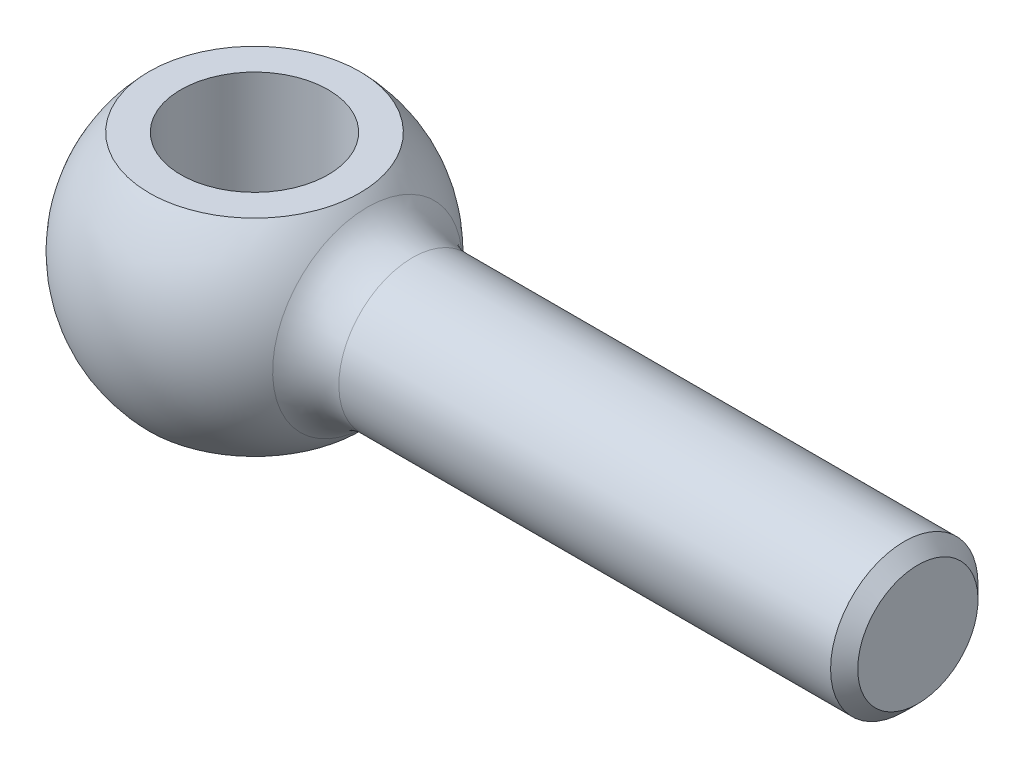
ISO-10303-21;
HEADER;
FILE_DESCRIPTION(('STEP AP214'),'2;1');
FILE_NAME('part.step','',(''),(''),'','','');
FILE_SCHEMA(('AUTOMOTIVE_DESIGN { 1 0 10303 214 1 1 1 1 }'));
ENDSEC;
DATA;
#1=APPLICATION_CONTEXT('core data for automotive mechanical design processes');
#2=APPLICATION_PROTOCOL_DEFINITION('international standard','automotive_design',2000,#1);
#3=PRODUCT_CONTEXT('',#1,'mechanical');
#4=PRODUCT('Part','Part','',(#3));
#5=PRODUCT_RELATED_PRODUCT_CATEGORY('part','',(#4));
#6=PRODUCT_DEFINITION_FORMATION('','',#4);
#7=PRODUCT_DEFINITION_CONTEXT('part definition',#1,'design');
#8=PRODUCT_DEFINITION('design','',#6,#7);
#9=PRODUCT_DEFINITION_SHAPE('','',#8);
#10=(LENGTH_UNIT() NAMED_UNIT(*) SI_UNIT(.MILLI.,.METRE.));
#11=(NAMED_UNIT(*) PLANE_ANGLE_UNIT() SI_UNIT($,.RADIAN.));
#12=(NAMED_UNIT(*) SI_UNIT($,.STERADIAN.) SOLID_ANGLE_UNIT());
#13=UNCERTAINTY_MEASURE_WITH_UNIT(LENGTH_MEASURE(1.E-05),#10,'distance_accuracy_value','');
#14=(GEOMETRIC_REPRESENTATION_CONTEXT(3) GLOBAL_UNCERTAINTY_ASSIGNED_CONTEXT((#13)) GLOBAL_UNIT_ASSIGNED_CONTEXT((#10,
#11,#12)) REPRESENTATION_CONTEXT('',''));
#15=CARTESIAN_POINT('',(0.,0.,0.));
#16=DIRECTION('',(0.,0.,1.));
#17=DIRECTION('',(1.,0.,0.));
#18=AXIS2_PLACEMENT_3D('',#15,#16,#17);
#19=CARTESIAN_POINT('',(-19.921175,53.1747455333215,0.));
#20=DIRECTION('',(0.,-1.,0.));
#21=DIRECTION('',(0.,0.,-1.));
#22=AXIS2_PLACEMENT_3D('',#19,#20,#21);
#23=CYLINDRICAL_SURFACE('',#22,5.);
#24=CARTESIAN_POINT('',(-19.921175,-7.,0.));
#25=DIRECTION('',(0.,-1.,0.));
#26=DIRECTION('',(0.,0.,-1.));
#27=AXIS2_PLACEMENT_3D('',#24,#25,#26);
#28=CIRCLE('',#27,5.);
#29=CARTESIAN_POINT('',(-19.921175,-7.,-5.));
#30=VERTEX_POINT('',#29);
#31=EDGE_CURVE('E19',#30,#30,#28,.T.);
#32=ORIENTED_EDGE('',*,*,#31,.T.);
#33=EDGE_LOOP('',(#32));
#34=FACE_BOUND('',#33,.T.);
#35=CARTESIAN_POINT('',(-19.921175,7.,0.));
#36=DIRECTION('',(0.,-1.,0.));
#37=DIRECTION('',(0.,0.,-1.));
#38=AXIS2_PLACEMENT_3D('',#35,#36,#37);
#39=CIRCLE('',#38,5.);
#40=CARTESIAN_POINT('',(-19.921175,7.,-5.));
#41=VERTEX_POINT('',#40);
#42=EDGE_CURVE('E45',#41,#41,#39,.F.);
#43=ORIENTED_EDGE('',*,*,#42,.T.);
#44=EDGE_LOOP('',(#43));
#45=FACE_BOUND('',#44,.T.);
#46=ADVANCED_FACE('F16',(#34,#45),#23,.F.);
#47=CARTESIAN_POINT('',(-9.921175,-7.,-7.14142842854285));
#48=DIRECTION('',(0.,1.,0.));
#49=DIRECTION('',(0.,0.,1.));
#50=AXIS2_PLACEMENT_3D('',#47,#48,#49);
#51=PLANE('',#50);
#52=ORIENTED_EDGE('',*,*,#31,.F.);
#53=EDGE_LOOP('',(#52));
#54=FACE_BOUND('',#53,.T.);
#55=CARTESIAN_POINT('',(-19.921175,-7.,-7.14142842854285));
#56=CARTESIAN_POINT('',(-20.121815802126,-7.,-7.14142986859224));
#57=CARTESIAN_POINT('',(-20.3224329771535,-7.,-7.13296934888317));
#58=CARTESIAN_POINT('',(-20.7223083544296,-7.,-7.09918632357595));
#59=CARTESIAN_POINT('',(-20.9215661852289,-6.99999999999999,-7.07385938198513));
#60=CARTESIAN_POINT('',(-21.3174147546647,-7.00000000000001,-7.00648721093299));
#61=CARTESIAN_POINT('',(-21.5140029565603,-7.00000000000002,-6.96442709358572));
#62=CARTESIAN_POINT('',(-21.9030073479158,-6.99999999999998,-6.8638701159207));
#63=CARTESIAN_POINT('',(-22.0954219852172,-6.99999999999993,-6.80536724969287));
#64=CARTESIAN_POINT('',(-22.4744732752498,-6.99999999999993,-6.67240392502897));
#65=CARTESIAN_POINT('',(-22.6611146729108,-6.99999999999998,-6.59795699230074));
#66=CARTESIAN_POINT('',(-23.0275306318683,-7.00000000000002,-6.43357519762648));
#67=CARTESIAN_POINT('',(-23.2073026360902,-7.,-6.34363463562185));
#68=CARTESIAN_POINT('',(-23.5585194217161,-7.,-6.14898457253382));
#69=CARTESIAN_POINT('',(-23.7299692772299,-7.,-6.04428422666276));
#70=CARTESIAN_POINT('',(-24.0635040866723,-7.,-5.82077528687992));
#71=CARTESIAN_POINT('',(-24.2255855610231,-7.,-5.70196150041679));
#72=CARTESIAN_POINT('',(-24.5391210307749,-7.,-5.45113461015148));
#73=CARTESIAN_POINT('',(-24.690577822971,-7.,-5.31912500231585));
#74=CARTESIAN_POINT('',(-24.981888574393,-7.,-5.04276727767858));
#75=CARTESIAN_POINT('',(-25.1217382286144,-7.,-4.89841462287307));
#76=CARTESIAN_POINT('',(-25.3887335416484,-7.,-4.5984889724675));
#77=CARTESIAN_POINT('',(-25.5158833747975,-7.,-4.44291969283042));
#78=CARTESIAN_POINT('',(-25.7566723691874,-7.,-4.12156491852506));
#79=CARTESIAN_POINT('',(-25.8703065247082,-7.,-3.95577567305133));
#80=CARTESIAN_POINT('',(-26.0831600756499,-7.,-3.61527806461891));
#81=CARTESIAN_POINT('',(-26.1823850428817,-7.,-3.44057318470467));
#82=CARTESIAN_POINT('',(-26.3658014953218,-7.,-3.08336104801744));
#83=CARTESIAN_POINT('',(-26.449987416743,-7.,-2.90085093447142));
#84=CARTESIAN_POINT('',(-26.6026534327003,-7.,-2.52945436820556));
#85=CARTESIAN_POINT('',(-26.6711393436741,-7.,-2.34057030671274));
#86=CARTESIAN_POINT('',(-26.7919816966742,-7.,-1.95763818981546));
#87=CARTESIAN_POINT('',(-26.8443321743561,-7.,-1.76358825360813));
#88=CARTESIAN_POINT('',(-26.9324781874185,-7.,-1.37182470924655));
#89=CARTESIAN_POINT('',(-26.968279793977,-7.,-1.17411247238744));
#90=CARTESIAN_POINT('',(-27.0231220903994,-7.,-0.776356914190344));
#91=CARTESIAN_POINT('',(-27.0421565872414,-7.,-0.576312759164369));
#92=CARTESIAN_POINT('',(-27.0738033201154,-7.,0.0250369248536359));
#93=CARTESIAN_POINT('',(-27.0610543880239,-7.,0.427986321027078));
#94=CARTESIAN_POINT('',(-26.9680842882136,-7.,1.22580539982465));
#95=CARTESIAN_POINT('',(-26.8878630953176,-7.,1.6206750794338));
#96=CARTESIAN_POINT('',(-26.6622672948254,-7.,2.39140128766026));
#97=CARTESIAN_POINT('',(-26.5168926184526,-7.,2.76725779620665));
#98=CARTESIAN_POINT('',(-26.1651054719343,-7.,3.48921380646209));
#99=CARTESIAN_POINT('',(-25.9586930216517,-7.,3.83531331785465));
#100=CARTESIAN_POINT('',(-25.4906928461824,-7.00000000000001,4.48795036671183));
#101=CARTESIAN_POINT('',(-25.2291051433289,-7.,4.79448792018974));
#102=CARTESIAN_POINT('',(-24.6581792730066,-7.,5.35929426043238));
#103=CARTESIAN_POINT('',(-24.3488410989941,-7.,5.61756304058228));
#104=CARTESIAN_POINT('',(-23.6911956846309,-7.00000000000001,6.07850174196653));
#105=CARTESIAN_POINT('',(-23.3428884391877,-7.00000000000001,6.28117165593503));
#106=CARTESIAN_POINT('',(-22.6171922927163,-7.00000000000001,6.62515898805196));
#107=CARTESIAN_POINT('',(-22.2398033929334,-7.00000000000001,6.76647640882725));
#108=CARTESIAN_POINT('',(-21.4666569194695,-7.,6.98374728002891));
#109=CARTESIAN_POINT('',(-21.0708993466161,-6.99999999999999,7.05970073339998));
#110=CARTESIAN_POINT('',(-20.2722499000277,-7.00000000000001,7.14408755076116));
#111=CARTESIAN_POINT('',(-19.8693580262928,-7.00000000000002,7.15252091475126));
#112=CARTESIAN_POINT('',(-19.0678768778328,-6.99999999999999,7.10162818869298));
#113=CARTESIAN_POINT('',(-18.6692876033016,-6.99999999999993,7.04230209559198));
#114=CARTESIAN_POINT('',(-17.8877264265291,-6.99999999999993,6.85757443490689));
#115=CARTESIAN_POINT('',(-17.5047545249564,-6.99999999999999,6.73217286449371));
#116=CARTESIAN_POINT('',(-16.7652996316435,-7.00000000000002,6.41885443506071));
#117=CARTESIAN_POINT('',(-16.4088166364416,-7.00000000000001,6.2309375842106));
#118=CARTESIAN_POINT('',(-15.7324589633657,-7.,5.79792159206619));
#119=CARTESIAN_POINT('',(-15.4125842804748,-7.,5.55282245860825));
#120=CARTESIAN_POINT('',(-14.8185236754241,-7.00000000000001,5.01240476893933));
#121=CARTESIAN_POINT('',(-14.5443377717577,-7.,4.71708619240125));
#122=CARTESIAN_POINT('',(-14.0494369334286,-7.,4.08459284269662));
#123=CARTESIAN_POINT('',(-13.8287220161664,-7.,3.74741805590921));
#124=CARTESIAN_POINT('',(-13.447033414173,-7.00000000000001,3.04085867103406));
#125=CARTESIAN_POINT('',(-13.2860596663786,-7.,2.67147410694765));
#126=CARTESIAN_POINT('',(-13.0284059260787,-7.,1.91070260901831));
#127=CARTESIAN_POINT('',(-12.9317259095823,-7.,1.51931568338555));
#128=CARTESIAN_POINT('',(-12.8369974153508,-7.,0.924631338080583));
#129=CARTESIAN_POINT('',(-12.8138042506701,-7.,0.725026595796795));
#130=CARTESIAN_POINT('',(-12.7843083533849,-7.,0.324592888927716));
#131=CARTESIAN_POINT('',(-12.7779993902821,-7.,0.123764403347191));
#132=CARTESIAN_POINT('',(-12.7823240599294,-7.,-0.277769768974396));
#133=CARTESIAN_POINT('',(-12.7929639163794,-7.,-0.478475383520475));
#134=CARTESIAN_POINT('',(-12.8311085991324,-7.,-0.878206372571495));
#135=CARTESIAN_POINT('',(-12.8586071997277,-7.,-1.07723233985526));
#136=CARTESIAN_POINT('',(-12.9302836255055,-7.,-1.47233335459713));
#137=CARTESIAN_POINT('',(-12.9744676384289,-7.,-1.66840727921256));
#138=CARTESIAN_POINT('',(-13.079179870739,-7.,-2.05606363995877));
#139=CARTESIAN_POINT('',(-13.1397020521615,-7.,-2.24764770699955));
#140=CARTESIAN_POINT('',(-13.2766945212751,-7.,-2.62511071035591));
#141=CARTESIAN_POINT('',(-13.353170985662,-7.,-2.81098740499663));
#142=CARTESIAN_POINT('',(-13.5214826895267,-7.,-3.1755685360639));
#143=CARTESIAN_POINT('',(-13.6133122499397,-7.,-3.35427559432129));
#144=CARTESIAN_POINT('',(-13.8117300597951,-7.,-3.70337767922704));
#145=CARTESIAN_POINT('',(-13.9183231679959,-7.,-3.87376994436641));
#146=CARTESIAN_POINT('',(-14.1454449479916,-7.,-4.20490623490604));
#147=CARTESIAN_POINT('',(-14.2659684614465,-7.,-4.36565379839525));
#148=CARTESIAN_POINT('',(-14.5201598888321,-7.,-4.67646779086718));
#149=CARTESIAN_POINT('',(-14.6538312684219,-7.,-4.82653138558618));
#150=CARTESIAN_POINT('',(-14.9332895964747,-7.,-5.11481034450373));
#151=CARTESIAN_POINT('',(-15.0790720570029,-7.,-5.25303005939112));
#152=CARTESIAN_POINT('',(-15.3818531340141,-7.,-5.51678277875058));
#153=CARTESIAN_POINT('',(-15.5388586259114,-7.,-5.64230789061971));
#154=CARTESIAN_POINT('',(-15.8628290246504,-7.,-5.87963721906419));
#155=CARTESIAN_POINT('',(-16.0297902396256,-7.,-5.99144647542316));
#156=CARTESIAN_POINT('',(-16.3726831147139,-7.,-6.2006917917259));
#157=CARTESIAN_POINT('',(-16.5486222417229,-7.,-6.29811561628654));
#158=CARTESIAN_POINT('',(-16.9080210502521,-7.,-6.47775029745588));
#159=CARTESIAN_POINT('',(-17.0914779587107,-7.,-6.55996670296368));
#160=CARTESIAN_POINT('',(-17.4645051204215,-7.,-6.70857974405571));
#161=CARTESIAN_POINT('',(-17.6540697815227,-7.,-6.7749904086117));
#162=CARTESIAN_POINT('',(-18.0380546433467,-7.,-6.89159759552849));
#163=CARTESIAN_POINT('',(-18.2324735537421,-6.99999999999999,-6.94179837829547));
#164=CARTESIAN_POINT('',(-18.6737224352808,-6.99999999999999,-7.03609425376486));
#165=CARTESIAN_POINT('',(-18.9215550401293,-7.,-7.0755610479892));
#166=CARTESIAN_POINT('',(-19.4199957132269,-7.,-7.12822723617195));
#167=CARTESIAN_POINT('',(-19.6706037814759,-7.,-7.14142663013034));
#168=CARTESIAN_POINT('',(-19.921175,-7.,-7.14142842854285));
#169=B_SPLINE_CURVE_WITH_KNOTS('',3,(#55,#56,#57,#58,#59,#60,#61,#62,#63,#64,#65,#66,#67,#68,
#69,#70,#71,#72,#73,#74,#75,#76,#77,#78,#79,#80,#81,#82,#83,#84,#85,#86,#87,#88,#89,#90,#91,#92,
#93,#94,#95,#96,#97,#98,#99,#100,#101,#102,#103,#104,#105,#106,#107,#108,#109,#110,#111,#112,
#113,#114,#115,#116,#117,#118,#119,#120,#121,#122,#123,#124,#125,#126,#127,#128,#129,#130,#131,
#132,#133,#134,#135,#136,#137,#138,#139,#140,#141,#142,#143,#144,#145,#146,#147,#148,#149,#150,
#151,#152,#153,#154,#155,#156,#157,#158,#159,#160,#161,#162,#163,#164,#165,#166,#167,#168),
.UNSPECIFIED.,.T.,.F.,(4,2,2,2,2,2,2,2,2,2,2,2,2,2,2,2,2,2,2,2,2,2,2,2,2,2,2,2,2,2,2,2,2,2,2,2,
2,2,2,2,2,2,2,2,2,2,2,2,2,2,2,2,2,2,2,2,4),(0.,0.601703537374053,1.20356538972438,
1.80596393408615,2.4085827982933,3.01069245819608,3.61302410732358,4.21498377222909,
4.81716559731527,5.4191883071872,6.0214333143561,6.62347971210541,7.22574839636951,
7.82778356890978,8.43004100885713,9.03207496650202,9.63433119542459,10.236366302774,
10.8386236818946,12.0418432976601,13.245063362403,14.4482846972761,15.6515056405957,
16.8547260968921,18.0579467180798,19.2611674965082,20.4643882234193,21.6676088961242,
22.8708295688291,24.0740502957402,25.2772710741686,26.4804916953562,27.6837121516527,
28.8869330949723,30.0901544298454,31.2933744945883,32.4965941103538,33.0988514894744,
33.7008865968238,34.3031428257464,34.9051767833913,35.5074342233386,36.1094693958789,
36.711738080143,37.3137844778923,37.9160294850612,38.5180521949331,39.1202340200193,
39.7221936849248,40.3245253340523,40.9266349939551,41.5292538581623,42.131652402524,
42.7335142548744,43.3352177922484,44.0866581122258,44.8380984322032),.UNSPECIFIED.);
#170=CARTESIAN_POINT('',(-19.921175,-7.,-7.14142842854285));
#171=VERTEX_POINT('',#170);
#172=EDGE_CURVE('E43',#171,#171,#169,.T.);
#173=ORIENTED_EDGE('',*,*,#172,.F.);
#174=EDGE_LOOP('',(#173));
#175=FACE_BOUND('',#174,.T.);
#176=ADVANCED_FACE('F55',(#54,#175),#51,.F.);
#177=CARTESIAN_POINT('',(-9.921175,7.,7.14142842854285));
#178=DIRECTION('',(0.,-1.,0.));
#179=DIRECTION('',(0.,0.,-1.));
#180=AXIS2_PLACEMENT_3D('',#177,#178,#179);
#181=PLANE('',#180);
#182=ORIENTED_EDGE('',*,*,#42,.F.);
#183=EDGE_LOOP('',(#182));
#184=FACE_BOUND('',#183,.T.);
#185=CARTESIAN_POINT('',(-19.921175,7.,7.14142842854285));
#186=CARTESIAN_POINT('',(-20.121815802126,7.,7.14142986859223));
#187=CARTESIAN_POINT('',(-20.3224329771535,7.,7.13296934888316));
#188=CARTESIAN_POINT('',(-20.7223083544296,7.,7.09918632357594));
#189=CARTESIAN_POINT('',(-20.9215661852289,7.,7.07385938198513));
#190=CARTESIAN_POINT('',(-21.3174147546647,7.,7.00648721093298));
#191=CARTESIAN_POINT('',(-21.5140029565603,7.00000000000002,6.96442709358571));
#192=CARTESIAN_POINT('',(-21.9030073479158,6.99999999999998,6.8638701159207));
#193=CARTESIAN_POINT('',(-22.0954219852172,6.99999999999994,6.80536724969286));
#194=CARTESIAN_POINT('',(-22.4744732752498,6.99999999999994,6.67240392502897));
#195=CARTESIAN_POINT('',(-22.6611146729108,6.99999999999998,6.59795699230074));
#196=CARTESIAN_POINT('',(-23.0275306318683,7.00000000000002,6.43357519762648));
#197=CARTESIAN_POINT('',(-23.2073026360902,7.,6.34363463562185));
#198=CARTESIAN_POINT('',(-23.5585194217161,7.,6.14898457253381));
#199=CARTESIAN_POINT('',(-23.7299692772298,7.,6.04428422666276));
#200=CARTESIAN_POINT('',(-24.0635040866723,7.,5.82077528687992));
#201=CARTESIAN_POINT('',(-24.2255855610231,7.,5.70196150041679));
#202=CARTESIAN_POINT('',(-24.5391210307749,7.,5.45113461015148));
#203=CARTESIAN_POINT('',(-24.6905778229709,7.,5.31912500231584));
#204=CARTESIAN_POINT('',(-24.981888574393,7.,5.04276727767858));
#205=CARTESIAN_POINT('',(-25.1217382286144,7.,4.89841462287307));
#206=CARTESIAN_POINT('',(-25.3887335416484,7.,4.5984889724675));
#207=CARTESIAN_POINT('',(-25.5158833747975,7.,4.44291969283042));
#208=CARTESIAN_POINT('',(-25.7566723691874,7.,4.12156491852506));
#209=CARTESIAN_POINT('',(-25.8703065247082,7.,3.95577567305132));
#210=CARTESIAN_POINT('',(-26.0831600756499,7.,3.61527806461891));
#211=CARTESIAN_POINT('',(-26.1823850428817,7.,3.44057318470466));
#212=CARTESIAN_POINT('',(-26.3658014953218,7.,3.08336104801744));
#213=CARTESIAN_POINT('',(-26.449987416743,7.,2.90085093447142));
#214=CARTESIAN_POINT('',(-26.6026534327003,7.,2.52945436820556));
#215=CARTESIAN_POINT('',(-26.6711393436741,7.,2.34057030671274));
#216=CARTESIAN_POINT('',(-26.7919816966742,7.,1.95763818981546));
#217=CARTESIAN_POINT('',(-26.8443321743561,7.,1.76358825360813));
#218=CARTESIAN_POINT('',(-26.9324781874185,7.,1.37182470924656));
#219=CARTESIAN_POINT('',(-26.968279793977,7.,1.17411247238744));
#220=CARTESIAN_POINT('',(-27.0231220903994,7.,0.776356914190345));
#221=CARTESIAN_POINT('',(-27.0421565872414,7.,0.57631275916437));
#222=CARTESIAN_POINT('',(-27.0738033201154,7.,-0.0250369248536355));
#223=CARTESIAN_POINT('',(-27.0610543880239,7.,-0.427986321027079));
#224=CARTESIAN_POINT('',(-26.9680842882136,7.,-1.22580539982465));
#225=CARTESIAN_POINT('',(-26.8878630953176,7.,-1.62067507943381));
#226=CARTESIAN_POINT('',(-26.6622672948254,7.,-2.39140128766026));
#227=CARTESIAN_POINT('',(-26.5168926184526,7.,-2.76725779620665));
#228=CARTESIAN_POINT('',(-26.1651054719343,7.,-3.48921380646209));
#229=CARTESIAN_POINT('',(-25.9586930216517,7.,-3.83531331785465));
#230=CARTESIAN_POINT('',(-25.4906928461824,7.,-4.48795036671183));
#231=CARTESIAN_POINT('',(-25.2291051433289,7.,-4.79448792018973));
#232=CARTESIAN_POINT('',(-24.6581792730066,7.,-5.35929426043238));
#233=CARTESIAN_POINT('',(-24.3488410989941,7.,-5.61756304058228));
#234=CARTESIAN_POINT('',(-23.6911956846309,7.,-6.07850174196653));
#235=CARTESIAN_POINT('',(-23.3428884391877,7.,-6.28117165593503));
#236=CARTESIAN_POINT('',(-22.6171922927163,7.,-6.62515898805196));
#237=CARTESIAN_POINT('',(-22.2398033929334,7.,-6.76647640882725));
#238=CARTESIAN_POINT('',(-21.4666569194695,7.,-6.98374728002891));
#239=CARTESIAN_POINT('',(-21.0708993466161,7.,-7.05970073339998));
#240=CARTESIAN_POINT('',(-20.2722499000277,7.00000000000001,-7.14408755076115));
#241=CARTESIAN_POINT('',(-19.8693580262928,7.00000000000002,-7.15252091475125));
#242=CARTESIAN_POINT('',(-19.0678768778328,6.99999999999998,-7.10162818869298));
#243=CARTESIAN_POINT('',(-18.6692876033016,6.99999999999993,-7.04230209559198));
#244=CARTESIAN_POINT('',(-17.8877264265291,6.99999999999993,-6.85757443490689));
#245=CARTESIAN_POINT('',(-17.5047545249564,6.99999999999998,-6.73217286449371));
#246=CARTESIAN_POINT('',(-16.7652996316435,7.00000000000002,-6.41885443506071));
#247=CARTESIAN_POINT('',(-16.4088166364416,7.,-6.2309375842106));
#248=CARTESIAN_POINT('',(-15.7324589633657,6.99999999999999,-5.79792159206619));
#249=CARTESIAN_POINT('',(-15.4125842804748,7.,-5.55282245860825));
#250=CARTESIAN_POINT('',(-14.8185236754241,7.,-5.01240476893933));
#251=CARTESIAN_POINT('',(-14.5443377717577,7.,-4.71708619240125));
#252=CARTESIAN_POINT('',(-14.0494369334286,7.,-4.08459284269662));
#253=CARTESIAN_POINT('',(-13.8287220161664,7.,-3.7474180559092));
#254=CARTESIAN_POINT('',(-13.447033414173,7.,-3.04085867103406));
#255=CARTESIAN_POINT('',(-13.2860596663786,7.,-2.67147410694764));
#256=CARTESIAN_POINT('',(-13.0284059260787,7.,-1.91070260901831));
#257=CARTESIAN_POINT('',(-12.9317259095823,7.,-1.51931568338555));
#258=CARTESIAN_POINT('',(-12.8369974153508,7.,-0.924631338080583));
#259=CARTESIAN_POINT('',(-12.8138042506701,7.,-0.725026595796796));
#260=CARTESIAN_POINT('',(-12.7843083533849,7.,-0.324592888927717));
#261=CARTESIAN_POINT('',(-12.7779993902821,7.,-0.123764403347193));
#262=CARTESIAN_POINT('',(-12.7823240599294,7.,0.277769768974393));
#263=CARTESIAN_POINT('',(-12.7929639163794,7.,0.478475383520472));
#264=CARTESIAN_POINT('',(-12.8311085991324,7.,0.878206372571492));
#265=CARTESIAN_POINT('',(-12.8586071997277,7.,1.07723233985526));
#266=CARTESIAN_POINT('',(-12.9302836255055,7.,1.47233335459713));
#267=CARTESIAN_POINT('',(-12.974467638429,7.,1.66840727921256));
#268=CARTESIAN_POINT('',(-13.079179870739,7.,2.05606363995877));
#269=CARTESIAN_POINT('',(-13.1397020521615,7.,2.24764770699954));
#270=CARTESIAN_POINT('',(-13.2766945212751,7.,2.62511071035591));
#271=CARTESIAN_POINT('',(-13.353170985662,7.,2.81098740499662));
#272=CARTESIAN_POINT('',(-13.5214826895267,7.,3.1755685360639));
#273=CARTESIAN_POINT('',(-13.6133122499397,7.,3.35427559432128));
#274=CARTESIAN_POINT('',(-13.8117300597951,7.,3.70337767922703));
#275=CARTESIAN_POINT('',(-13.918323167996,7.,3.8737699443664));
#276=CARTESIAN_POINT('',(-14.1454449479916,7.,4.20490623490604));
#277=CARTESIAN_POINT('',(-14.2659684614465,7.,4.36565379839524));
#278=CARTESIAN_POINT('',(-14.5201598888321,7.,4.67646779086717));
#279=CARTESIAN_POINT('',(-14.6538312684219,7.,4.82653138558617));
#280=CARTESIAN_POINT('',(-14.9332895964747,7.,5.11481034450372));
#281=CARTESIAN_POINT('',(-15.0790720570029,7.,5.25303005939111));
#282=CARTESIAN_POINT('',(-15.3818531340141,7.,5.51678277875057));
#283=CARTESIAN_POINT('',(-15.5388586259114,7.,5.6423078906197));
#284=CARTESIAN_POINT('',(-15.8628290246504,7.,5.87963721906417));
#285=CARTESIAN_POINT('',(-16.0297902396256,7.,5.99144647542315));
#286=CARTESIAN_POINT('',(-16.3726831147139,7.,6.2006917917259));
#287=CARTESIAN_POINT('',(-16.5486222417229,7.,6.29811561628653));
#288=CARTESIAN_POINT('',(-16.9080210502521,7.,6.47775029745587));
#289=CARTESIAN_POINT('',(-17.0914779587107,7.,6.55996670296367));
#290=CARTESIAN_POINT('',(-17.4645051204215,7.,6.70857974405571));
#291=CARTESIAN_POINT('',(-17.6540697815227,7.,6.77499040861169));
#292=CARTESIAN_POINT('',(-18.0380546433467,7.,6.89159759552848));
#293=CARTESIAN_POINT('',(-18.2324735537421,7.,6.94179837829547));
#294=CARTESIAN_POINT('',(-18.6737224352808,7.,7.03609425376485));
#295=CARTESIAN_POINT('',(-18.9215550401293,7.,7.0755610479892));
#296=CARTESIAN_POINT('',(-19.4199957132269,7.,7.12822723617194));
#297=CARTESIAN_POINT('',(-19.6706037814759,7.,7.14142663013034));
#298=CARTESIAN_POINT('',(-19.921175,7.,7.14142842854285));
#299=B_SPLINE_CURVE_WITH_KNOTS('',3,(#185,#186,#187,#188,#189,#190,#191,#192,#193,#194,#195,
#196,#197,#198,#199,#200,#201,#202,#203,#204,#205,#206,#207,#208,#209,#210,#211,#212,#213,#214,
#215,#216,#217,#218,#219,#220,#221,#222,#223,#224,#225,#226,#227,#228,#229,#230,#231,#232,#233,
#234,#235,#236,#237,#238,#239,#240,#241,#242,#243,#244,#245,#246,#247,#248,#249,#250,#251,#252,
#253,#254,#255,#256,#257,#258,#259,#260,#261,#262,#263,#264,#265,#266,#267,#268,#269,#270,#271,
#272,#273,#274,#275,#276,#277,#278,#279,#280,#281,#282,#283,#284,#285,#286,#287,#288,#289,#290,
#291,#292,#293,#294,#295,#296,#297,#298),.UNSPECIFIED.,.T.,.F.,(4,2,2,2,2,2,2,2,2,2,2,2,2,2,2,2,
2,2,2,2,2,2,2,2,2,2,2,2,2,2,2,2,2,2,2,2,2,2,2,2,2,2,2,2,2,2,2,2,2,2,2,2,2,2,2,2,4),(0.,
0.601703537374057,1.20356538972437,1.80596393408614,2.4085827982933,3.01069245819608,
3.61302410732357,4.21498377222909,4.81716559731527,5.41918830718719,6.02143331435609,
6.6234797121054,7.2257483963695,7.82778356890977,8.43004100885712,9.03207496650201,
9.63433119542458,10.236366302774,10.8386236818946,12.0418432976601,13.245063362403,
14.4482846972761,15.6515056405957,16.8547260968921,18.0579467180798,19.2611674965082,
20.4643882234193,21.6676088961242,22.8708295688291,24.0740502957402,25.2772710741686,
26.4804916953562,27.6837121516526,28.8869330949723,30.0901544298454,31.2933744945883,
32.4965941103538,33.0988514894744,33.7008865968238,34.3031428257464,34.9051767833913,
35.5074342233386,36.1094693958789,36.711738080143,37.3137844778923,37.9160294850612,
38.5180521949331,39.1202340200193,39.7221936849248,40.3245253340523,40.9266349939551,
41.5292538581622,42.131652402524,42.7335142548743,43.3352177922484,44.0866581122258,
44.8380984322032),.UNSPECIFIED.);
#300=CARTESIAN_POINT('',(-19.921175,7.,7.14142842854285));
#301=VERTEX_POINT('',#300);
#302=EDGE_CURVE('E40',#301,#301,#299,.T.);
#303=ORIENTED_EDGE('',*,*,#302,.F.);
#304=EDGE_LOOP('',(#303));
#305=FACE_BOUND('',#304,.T.);
#306=ADVANCED_FACE('F31',(#184,#305),#181,.F.);
#307=CARTESIAN_POINT('',(-19.921175,0.,0.));
#308=DIRECTION('',(1.,0.,0.));
#309=DIRECTION('',(0.,1.,0.));
#310=AXIS2_PLACEMENT_3D('',#307,#308,#309);
#311=SPHERICAL_SURFACE('',#310,10.);
#312=CARTESIAN_POINT('',(-29.921175,0.,0.));
#313=VERTEX_POINT('',#312);
#314=VERTEX_LOOP('',#313);
#315=FACE_BOUND('',#314,.T.);
#316=CARTESIAN_POINT('',(-12.2613140751689,0.,0.));
#317=DIRECTION('',(1.,0.,0.));
#318=DIRECTION('',(0.,0.,-1.));
#319=AXIS2_PLACEMENT_3D('',#316,#317,#318);
#320=CIRCLE('',#319,6.42857142857146);
#321=CARTESIAN_POINT('',(-12.2613140751689,0.,-6.42857142857146));
#322=VERTEX_POINT('',#321);
#323=EDGE_CURVE('E36',#322,#322,#320,.F.);
#324=ORIENTED_EDGE('',*,*,#323,.T.);
#325=EDGE_LOOP('',(#324));
#326=FACE_BOUND('',#325,.T.);
#327=ORIENTED_EDGE('',*,*,#302,.T.);
#328=EDGE_LOOP('',(#327));
#329=FACE_BOUND('',#328,.T.);
#330=ORIENTED_EDGE('',*,*,#172,.T.);
#331=EDGE_LOOP('',(#330));
#332=FACE_BOUND('',#331,.T.);
#333=ADVANCED_FACE('F27',(#315,#326,#329,#332),#311,.T.);
#334=CARTESIAN_POINT('',(25.078825,2.5,0.));
#335=DIRECTION('',(1.,0.,0.));
#336=DIRECTION('',(0.,1.,0.));
#337=AXIS2_PLACEMENT_3D('',#334,#335,#336);
#338=PLANE('',#337);
#339=CARTESIAN_POINT('',(25.07882499998,0.,0.));
#340=DIRECTION('',(-1.,0.,0.));
#341=DIRECTION('',(0.,-1.,0.));
#342=AXIS2_PLACEMENT_3D('',#339,#340,#341);
#343=CIRCLE('',#342,4.07882500002188);
#344=CARTESIAN_POINT('',(25.07882499998,-4.07882500002187,0.));
#345=VERTEX_POINT('',#344);
#346=EDGE_CURVE('E67',#345,#345,#343,.T.);
#347=ORIENTED_EDGE('',*,*,#346,.F.);
#348=EDGE_LOOP('',(#347));
#349=FACE_BOUND('',#348,.T.);
#350=ADVANCED_FACE('F30',(#349),#338,.T.);
#351=CARTESIAN_POINT('',(-9.19736970523639,0.,0.));
#352=DIRECTION('',(1.,0.,0.));
#353=DIRECTION('',(0.,0.,-1.));
#354=AXIS2_PLACEMENT_3D('',#351,#352,#353);
#355=TOROIDAL_SURFACE('',#354,9.,4.);
#356=CARTESIAN_POINT('',(-9.19736970523639,0.,0.));
#357=DIRECTION('',(1.,0.,0.));
#358=DIRECTION('',(0.,1.,0.));
#359=AXIS2_PLACEMENT_3D('',#356,#357,#358);
#360=CIRCLE('',#359,5.);
#361=CARTESIAN_POINT('',(-9.19736970523639,5.,0.));
#362=VERTEX_POINT('',#361);
#363=EDGE_CURVE('E23',#362,#362,#360,.T.);
#364=ORIENTED_EDGE('',*,*,#363,.F.);
#365=EDGE_LOOP('',(#364));
#366=FACE_BOUND('',#365,.T.);
#367=ORIENTED_EDGE('',*,*,#323,.F.);
#368=EDGE_LOOP('',(#367));
#369=FACE_BOUND('',#368,.T.);
#370=ADVANCED_FACE('F77',(#366,#369),#355,.F.);
#371=CARTESIAN_POINT('',(24.1576499999496,0.,0.));
#372=DIRECTION('',(-1.,0.,0.));
#373=DIRECTION('',(0.,-1.,0.));
#374=AXIS2_PLACEMENT_3D('',#371,#372,#373);
#375=CONICAL_SURFACE('',#374,4.99999999999546,0.785398163366594);
#376=ORIENTED_EDGE('',*,*,#346,.T.);
#377=EDGE_LOOP('',(#376));
#378=FACE_BOUND('',#377,.T.);
#379=CARTESIAN_POINT('',(24.15765,0.,0.));
#380=DIRECTION('',(1.,0.,0.));
#381=DIRECTION('',(0.,1.,0.));
#382=AXIS2_PLACEMENT_3D('',#379,#380,#381);
#383=CIRCLE('',#382,5.);
#384=CARTESIAN_POINT('',(24.15765,5.,0.));
#385=VERTEX_POINT('',#384);
#386=EDGE_CURVE('E11',#385,#385,#383,.F.);
#387=ORIENTED_EDGE('',*,*,#386,.F.);
#388=EDGE_LOOP('',(#387));
#389=FACE_BOUND('',#388,.T.);
#390=ADVANCED_FACE('F80',(#378,#389),#375,.T.);
#391=CARTESIAN_POINT('',(12.5394125,0.,0.));
#392=DIRECTION('',(1.,0.,0.));
#393=DIRECTION('',(0.,1.,0.));
#394=AXIS2_PLACEMENT_3D('',#391,#392,#393);
#395=CYLINDRICAL_SURFACE('',#394,5.);
#396=ORIENTED_EDGE('',*,*,#386,.T.);
#397=EDGE_LOOP('',(#396));
#398=FACE_BOUND('',#397,.T.);
#399=ORIENTED_EDGE('',*,*,#363,.T.);
#400=EDGE_LOOP('',(#399));
#401=FACE_BOUND('',#400,.T.);
#402=ADVANCED_FACE('F84',(#398,#401),#395,.T.);
#403=CLOSED_SHELL('',(#46,#176,#306,#333,#350,#370,#390,#402));
#404=MANIFOLD_SOLID_BREP('B1',#403);
#405=ADVANCED_BREP_SHAPE_REPRESENTATION('',(#18,#404),#14);
#406=SHAPE_DEFINITION_REPRESENTATION(#9,#405);
ENDSEC;
END-ISO-10303-21;
